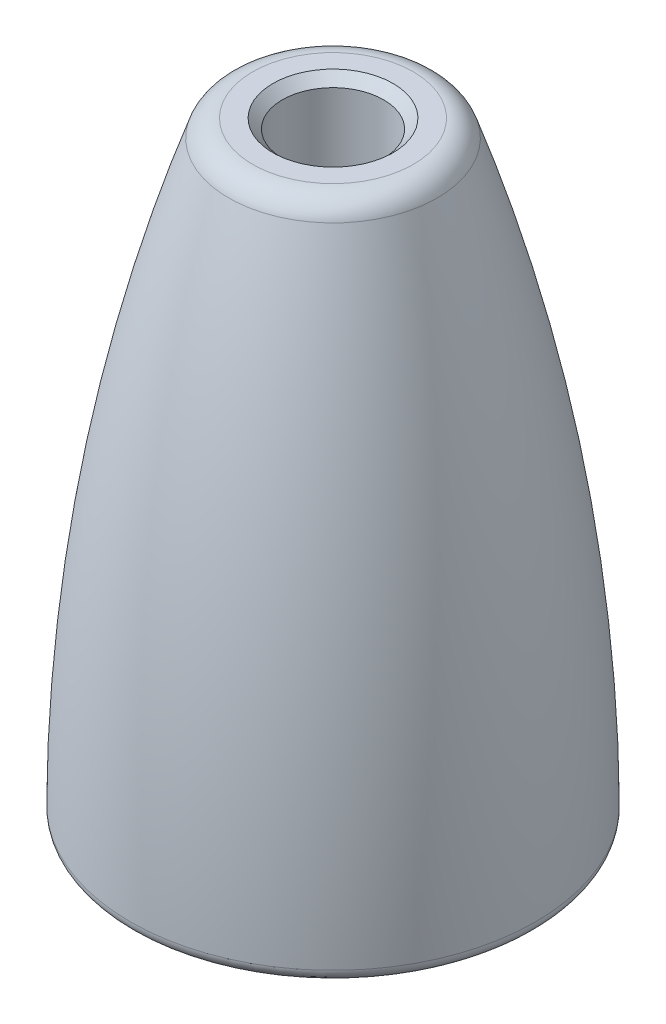
ISO-10303-21;
HEADER;
FILE_DESCRIPTION(('STEP AP214'),'2;1');
FILE_NAME('part.step','',(''),(''),'','','');
FILE_SCHEMA(('AUTOMOTIVE_DESIGN { 1 0 10303 214 1 1 1 1 }'));
ENDSEC;
DATA;
#1=APPLICATION_CONTEXT('core data for automotive mechanical design processes');
#2=APPLICATION_PROTOCOL_DEFINITION('international standard','automotive_design',2000,#1);
#3=PRODUCT_CONTEXT('',#1,'mechanical');
#4=PRODUCT('Part','Part','',(#3));
#5=PRODUCT_RELATED_PRODUCT_CATEGORY('part','',(#4));
#6=PRODUCT_DEFINITION_FORMATION('','',#4);
#7=PRODUCT_DEFINITION_CONTEXT('part definition',#1,'design');
#8=PRODUCT_DEFINITION('design','',#6,#7);
#9=PRODUCT_DEFINITION_SHAPE('','',#8);
#10=(LENGTH_UNIT() NAMED_UNIT(*) SI_UNIT(.MILLI.,.METRE.));
#11=(NAMED_UNIT(*) PLANE_ANGLE_UNIT() SI_UNIT($,.RADIAN.));
#12=(NAMED_UNIT(*) SI_UNIT($,.STERADIAN.) SOLID_ANGLE_UNIT());
#13=UNCERTAINTY_MEASURE_WITH_UNIT(LENGTH_MEASURE(1.E-05),#10,'distance_accuracy_value','');
#14=(GEOMETRIC_REPRESENTATION_CONTEXT(3) GLOBAL_UNCERTAINTY_ASSIGNED_CONTEXT((#13)) GLOBAL_UNIT_ASSIGNED_CONTEXT((#10,
#11,#12)) REPRESENTATION_CONTEXT('',''));
#15=CARTESIAN_POINT('',(0.,0.,0.));
#16=DIRECTION('',(0.,0.,1.));
#17=DIRECTION('',(1.,0.,0.));
#18=AXIS2_PLACEMENT_3D('',#15,#16,#17);
#19=CARTESIAN_POINT('',(0.,16.112215027752,0.));
#20=DIRECTION('',(0.,-1.,0.));
#21=DIRECTION('',(0.,0.,-1.));
#22=AXIS2_PLACEMENT_3D('',#19,#20,#21);
#23=TOROIDAL_SURFACE('',#22,2.01385328431653,0.634999999999998);
#24=CARTESIAN_POINT('',(0.,16.747215027752,0.));
#25=DIRECTION('',(0.,-1.,0.));
#26=DIRECTION('',(0.,0.,-1.));
#27=AXIS2_PLACEMENT_3D('',#24,#25,#26);
#28=CIRCLE('',#27,2.01385328431653);
#29=CARTESIAN_POINT('',(0.,16.747215027752,-2.01385328431653));
#30=VERTEX_POINT('',#29);
#31=EDGE_CURVE('E10',#30,#30,#28,.T.);
#32=ORIENTED_EDGE('',*,*,#31,.T.);
#33=EDGE_LOOP('',(#32));
#34=FACE_BOUND('',#33,.T.);
#35=CARTESIAN_POINT('',(0.,16.3179192531041,0.));
#36=DIRECTION('',(0.,-1.,0.));
#37=DIRECTION('',(0.,0.,-1.));
#38=AXIS2_PLACEMENT_3D('',#35,#36,#37);
#39=CIRCLE('',#38,2.61461178127874);
#40=CARTESIAN_POINT('',(0.,16.3179192531041,-2.61461178127874));
#41=VERTEX_POINT('',#40);
#42=EDGE_CURVE('E58',#41,#41,#39,.T.);
#43=ORIENTED_EDGE('',*,*,#42,.F.);
#44=EDGE_LOOP('',(#43));
#45=FACE_BOUND('',#44,.T.);
#46=ADVANCED_FACE('F30',(#34,#45),#23,.T.);
#47=CARTESIAN_POINT('',(0.,16.747215027752,-1.50627906976744));
#48=DIRECTION('',(0.,1.,0.));
#49=DIRECTION('',(0.,0.,1.));
#50=AXIS2_PLACEMENT_3D('',#47,#48,#49);
#51=PLANE('',#50);
#52=CARTESIAN_POINT('',(0.,16.747215027752,0.));
#53=DIRECTION('',(0.,-1.,0.));
#54=DIRECTION('',(0.,0.,-1.));
#55=AXIS2_PLACEMENT_3D('',#52,#53,#54);
#56=CIRCLE('',#55,1.50627906976744);
#57=CARTESIAN_POINT('',(0.,16.747215027752,-1.50627906976744));
#58=VERTEX_POINT('',#57);
#59=EDGE_CURVE('E36',#58,#58,#56,.T.);
#60=ORIENTED_EDGE('',*,*,#59,.T.);
#61=EDGE_LOOP('',(#60));
#62=FACE_BOUND('',#61,.T.);
#63=ORIENTED_EDGE('',*,*,#31,.F.);
#64=EDGE_LOOP('',(#63));
#65=FACE_BOUND('',#64,.T.);
#66=ADVANCED_FACE('F66',(#62,#65),#51,.T.);
#67=CARTESIAN_POINT('',(0.,16.747215027752,0.));
#68=DIRECTION('',(0.,1.,0.));
#69=DIRECTION('',(0.,0.,1.));
#70=AXIS2_PLACEMENT_3D('',#67,#68,#69);
#71=CONICAL_SURFACE('',#70,1.50627906976744,0.785398163397448);
#72=CARTESIAN_POINT('',(0.,16.5109359579845,0.));
#73=DIRECTION('',(0.,-1.,0.));
#74=DIRECTION('',(0.,0.,-1.));
#75=AXIS2_PLACEMENT_3D('',#72,#73,#74);
#76=CIRCLE('',#75,1.27);
#77=CARTESIAN_POINT('',(0.,16.5109359579845,-1.27));
#78=VERTEX_POINT('',#77);
#79=EDGE_CURVE('E40',#78,#78,#76,.T.);
#80=ORIENTED_EDGE('',*,*,#79,.T.);
#81=EDGE_LOOP('',(#80));
#82=FACE_BOUND('',#81,.T.);
#83=ORIENTED_EDGE('',*,*,#59,.F.);
#84=EDGE_LOOP('',(#83));
#85=FACE_BOUND('',#84,.T.);
#86=ADVANCED_FACE('F70',(#82,#85),#71,.F.);
#87=CARTESIAN_POINT('',(0.,1.50721502775197,0.));
#88=DIRECTION('',(0.,-1.,0.));
#89=DIRECTION('',(0.,0.,-1.));
#90=AXIS2_PLACEMENT_3D('',#87,#88,#89);
#91=CYLINDRICAL_SURFACE('',#90,1.27);
#92=CARTESIAN_POINT('',(0.,1.74349409751941,0.));
#93=DIRECTION('',(0.,-1.,0.));
#94=DIRECTION('',(0.,0.,-1.));
#95=AXIS2_PLACEMENT_3D('',#92,#93,#94);
#96=CIRCLE('',#95,1.27);
#97=CARTESIAN_POINT('',(0.,1.74349409751941,-1.27));
#98=VERTEX_POINT('',#97);
#99=EDGE_CURVE('E44',#98,#98,#96,.T.);
#100=ORIENTED_EDGE('',*,*,#99,.T.);
#101=EDGE_LOOP('',(#100));
#102=FACE_BOUND('',#101,.T.);
#103=ORIENTED_EDGE('',*,*,#79,.F.);
#104=EDGE_LOOP('',(#103));
#105=FACE_BOUND('',#104,.T.);
#106=ADVANCED_FACE('F74',(#102,#105),#91,.F.);
#107=CARTESIAN_POINT('',(0.,1.74349409751941,0.));
#108=DIRECTION('',(0.,-1.,0.));
#109=DIRECTION('',(0.,0.,-1.));
#110=AXIS2_PLACEMENT_3D('',#107,#108,#109);
#111=CONICAL_SURFACE('',#110,1.27,0.785398163397448);
#112=CARTESIAN_POINT('',(0.,1.50721502775197,0.));
#113=DIRECTION('',(0.,-1.,0.));
#114=DIRECTION('',(0.,0.,-1.));
#115=AXIS2_PLACEMENT_3D('',#112,#113,#114);
#116=CIRCLE('',#115,1.50627906976744);
#117=CARTESIAN_POINT('',(0.,1.50721502775197,-1.50627906976744));
#118=VERTEX_POINT('',#117);
#119=EDGE_CURVE('E49',#118,#118,#116,.T.);
#120=ORIENTED_EDGE('',*,*,#119,.T.);
#121=EDGE_LOOP('',(#120));
#122=FACE_BOUND('',#121,.T.);
#123=ORIENTED_EDGE('',*,*,#99,.F.);
#124=EDGE_LOOP('',(#123));
#125=FACE_BOUND('',#124,.T.);
#126=ADVANCED_FACE('F81',(#122,#125),#111,.F.);
#127=CARTESIAN_POINT('',(0.,1.50721502775196,-1.50627906976744));
#128=DIRECTION('',(0.,-1.,0.));
#129=DIRECTION('',(0.,0.,-1.));
#130=AXIS2_PLACEMENT_3D('',#127,#128,#129);
#131=PLANE('',#130);
#132=CARTESIAN_POINT('',(0.,1.50721502775196,0.));
#133=DIRECTION('',(0.,-1.,0.));
#134=DIRECTION('',(0.,0.,-1.));
#135=AXIS2_PLACEMENT_3D('',#132,#133,#134);
#136=CIRCLE('',#135,4.76138984656748);
#137=CARTESIAN_POINT('',(0.,1.50721502775196,-4.76138984656748));
#138=VERTEX_POINT('',#137);
#139=EDGE_CURVE('E52',#138,#138,#136,.T.);
#140=ORIENTED_EDGE('',*,*,#139,.T.);
#141=EDGE_LOOP('',(#140));
#142=FACE_BOUND('',#141,.T.);
#143=ORIENTED_EDGE('',*,*,#119,.F.);
#144=EDGE_LOOP('',(#143));
#145=FACE_BOUND('',#144,.T.);
#146=ADVANCED_FACE('F85',(#142,#145),#131,.T.);
#147=CARTESIAN_POINT('',(0.,1.82471502775197,0.));
#148=DIRECTION('',(0.,-1.,0.));
#149=DIRECTION('',(0.,0.,-1.));
#150=AXIS2_PLACEMENT_3D('',#147,#148,#149);
#151=TOROIDAL_SURFACE('',#150,4.76138984656748,0.317500000000002);
#152=CARTESIAN_POINT('',(0.,1.82693530747225,0.));
#153=DIRECTION('',(0.,-1.,0.));
#154=DIRECTION('',(0.,0.,-1.));
#155=AXIS2_PLACEMENT_3D('',#152,#153,#154);
#156=CIRCLE('',#155,5.07888208325676);
#157=CARTESIAN_POINT('',(0.,1.82693530747225,-5.07888208325676));
#158=VERTEX_POINT('',#157);
#159=EDGE_CURVE('E55',#158,#158,#156,.T.);
#160=ORIENTED_EDGE('',*,*,#159,.T.);
#161=EDGE_LOOP('',(#160));
#162=FACE_BOUND('',#161,.T.);
#163=ORIENTED_EDGE('',*,*,#139,.F.);
#164=EDGE_LOOP('',(#163));
#165=FACE_BOUND('',#164,.T.);
#166=ADVANCED_FACE('F89',(#162,#165),#151,.T.);
#167=CARTESIAN_POINT('',(0.,1.50721502775197,0.));
#168=DIRECTION('',(0.,-1.,0.));
#169=DIRECTION('',(0.,0.,-1.));
#170=AXIS2_PLACEMENT_3D('',#167,#168,#169);
#171=DEGENERATE_TOROIDAL_SURFACE('',#170,40.64,45.72,.F.);
#172=ORIENTED_EDGE('',*,*,#42,.T.);
#173=EDGE_LOOP('',(#172));
#174=FACE_BOUND('',#173,.T.);
#175=ORIENTED_EDGE('',*,*,#159,.F.);
#176=EDGE_LOOP('',(#175));
#177=FACE_BOUND('',#176,.T.);
#178=ADVANCED_FACE('F62',(#174,#177),#171,.F.);
#179=CLOSED_SHELL('',(#46,#66,#86,#106,#126,#146,#166,#178));
#180=MANIFOLD_SOLID_BREP('B2',#179);
#181=ADVANCED_BREP_SHAPE_REPRESENTATION('',(#18,#180),#14);
#182=SHAPE_DEFINITION_REPRESENTATION(#9,#181);
ENDSEC;
END-ISO-10303-21;
